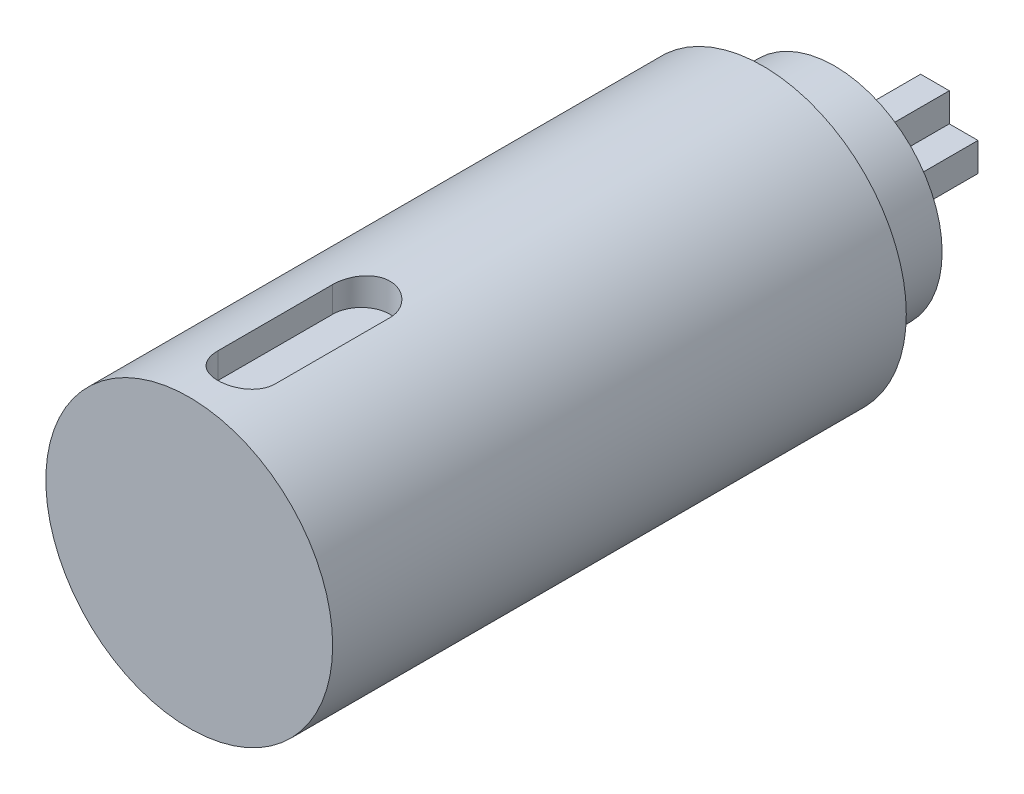
ISO-10303-21;
HEADER;
FILE_DESCRIPTION(('STEP AP214'),'2;1');
FILE_NAME('part.step','',(''),(''),'','','');
FILE_SCHEMA(('AUTOMOTIVE_DESIGN { 1 0 10303 214 1 1 1 1 }'));
ENDSEC;
DATA;
#1=APPLICATION_CONTEXT('core data for automotive mechanical design processes');
#2=APPLICATION_PROTOCOL_DEFINITION('international standard','automotive_design',2000,#1);
#3=PRODUCT_CONTEXT('',#1,'mechanical');
#4=PRODUCT('Part','Part','',(#3));
#5=PRODUCT_RELATED_PRODUCT_CATEGORY('part','',(#4));
#6=PRODUCT_DEFINITION_FORMATION('','',#4);
#7=PRODUCT_DEFINITION_CONTEXT('part definition',#1,'design');
#8=PRODUCT_DEFINITION('design','',#6,#7);
#9=PRODUCT_DEFINITION_SHAPE('','',#8);
#10=(LENGTH_UNIT() NAMED_UNIT(*) SI_UNIT(.MILLI.,.METRE.));
#11=(NAMED_UNIT(*) PLANE_ANGLE_UNIT() SI_UNIT($,.RADIAN.));
#12=(NAMED_UNIT(*) SI_UNIT($,.STERADIAN.) SOLID_ANGLE_UNIT());
#13=UNCERTAINTY_MEASURE_WITH_UNIT(LENGTH_MEASURE(1.E-05),#10,'distance_accuracy_value','');
#14=(GEOMETRIC_REPRESENTATION_CONTEXT(3) GLOBAL_UNCERTAINTY_ASSIGNED_CONTEXT((#13)) GLOBAL_UNIT_ASSIGNED_CONTEXT((#10,
#11,#12)) REPRESENTATION_CONTEXT('',''));
#15=CARTESIAN_POINT('',(0.,0.,0.));
#16=DIRECTION('',(0.,0.,1.));
#17=DIRECTION('',(1.,0.,0.));
#18=AXIS2_PLACEMENT_3D('',#15,#16,#17);
#19=CARTESIAN_POINT('',(0.,0.,0.));
#20=DIRECTION('',(0.,0.,1.));
#21=DIRECTION('',(1.,0.,0.));
#22=AXIS2_PLACEMENT_3D('',#19,#20,#21);
#23=PLANE('',#22);
#24=CARTESIAN_POINT('',(0.,0.,0.));
#25=DIRECTION('',(0.,0.,1.));
#26=DIRECTION('',(1.,0.,0.));
#27=AXIS2_PLACEMENT_3D('',#24,#25,#26);
#28=CIRCLE('',#27,7.5);
#29=CARTESIAN_POINT('',(7.5,0.,0.));
#30=VERTEX_POINT('',#29);
#31=EDGE_CURVE('E283',#30,#30,#28,.T.);
#32=ORIENTED_EDGE('',*,*,#31,.F.);
#33=EDGE_LOOP('',(#32));
#34=FACE_BOUND('',#33,.T.);
#35=DIRECTION('',(-1.,0.,0.));
#36=VECTOR('',#35,1.);
#37=CARTESIAN_POINT('',(0.,-1.,0.));
#38=LINE('',#37,#36);
#39=CARTESIAN_POINT('',(3.,-1.,0.));
#40=VERTEX_POINT('',#39);
#41=CARTESIAN_POINT('',(1.,-1.,0.));
#42=VERTEX_POINT('',#41);
#43=EDGE_CURVE('E62',#40,#42,#38,.T.);
#44=ORIENTED_EDGE('',*,*,#43,.F.);
#45=DIRECTION('',(0.,-1.,0.));
#46=VECTOR('',#45,1.);
#47=CARTESIAN_POINT('',(3.,0.,0.));
#48=LINE('',#47,#46);
#49=CARTESIAN_POINT('',(3.,1.,0.));
#50=VERTEX_POINT('',#49);
#51=EDGE_CURVE('E193',#50,#40,#48,.T.);
#52=ORIENTED_EDGE('',*,*,#51,.F.);
#53=DIRECTION('',(-1.,0.,0.));
#54=VECTOR('',#53,1.);
#55=CARTESIAN_POINT('',(0.,1.,0.));
#56=LINE('',#55,#54);
#57=CARTESIAN_POINT('',(1.,1.,0.));
#58=VERTEX_POINT('',#57);
#59=EDGE_CURVE('E245',#50,#58,#56,.T.);
#60=ORIENTED_EDGE('',*,*,#59,.T.);
#61=DIRECTION('',(0.,-1.,0.));
#62=VECTOR('',#61,1.);
#63=CARTESIAN_POINT('',(1.,0.,0.));
#64=LINE('',#63,#62);
#65=CARTESIAN_POINT('',(1.,3.,0.));
#66=VERTEX_POINT('',#65);
#67=EDGE_CURVE('E242',#66,#58,#64,.T.);
#68=ORIENTED_EDGE('',*,*,#67,.F.);
#69=DIRECTION('',(-1.,0.,0.));
#70=VECTOR('',#69,1.);
#71=CARTESIAN_POINT('',(0.,3.,0.));
#72=LINE('',#71,#70);
#73=CARTESIAN_POINT('',(-1.,3.,0.));
#74=VERTEX_POINT('',#73);
#75=EDGE_CURVE('E240',#66,#74,#72,.T.);
#76=ORIENTED_EDGE('',*,*,#75,.T.);
#77=DIRECTION('',(0.,-1.,0.));
#78=VECTOR('',#77,1.);
#79=CARTESIAN_POINT('',(-1.,0.,0.));
#80=LINE('',#79,#78);
#81=CARTESIAN_POINT('',(-1.,1.,0.));
#82=VERTEX_POINT('',#81);
#83=EDGE_CURVE('E238',#74,#82,#80,.T.);
#84=ORIENTED_EDGE('',*,*,#83,.T.);
#85=DIRECTION('',(-1.,0.,0.));
#86=VECTOR('',#85,1.);
#87=CARTESIAN_POINT('',(0.,1.,0.));
#88=LINE('',#87,#86);
#89=CARTESIAN_POINT('',(-3.,1.,0.));
#90=VERTEX_POINT('',#89);
#91=EDGE_CURVE('E236',#82,#90,#88,.T.);
#92=ORIENTED_EDGE('',*,*,#91,.T.);
#93=DIRECTION('',(0.,-1.,0.));
#94=VECTOR('',#93,1.);
#95=CARTESIAN_POINT('',(-3.,0.,0.));
#96=LINE('',#95,#94);
#97=CARTESIAN_POINT('',(-3.,-1.,0.));
#98=VERTEX_POINT('',#97);
#99=EDGE_CURVE('E234',#90,#98,#96,.T.);
#100=ORIENTED_EDGE('',*,*,#99,.T.);
#101=DIRECTION('',(-1.,0.,0.));
#102=VECTOR('',#101,1.);
#103=CARTESIAN_POINT('',(0.,-1.,0.));
#104=LINE('',#103,#102);
#105=CARTESIAN_POINT('',(-1.,-1.,0.));
#106=VERTEX_POINT('',#105);
#107=EDGE_CURVE('E231',#106,#98,#104,.T.);
#108=ORIENTED_EDGE('',*,*,#107,.F.);
#109=DIRECTION('',(0.,-1.,0.));
#110=VECTOR('',#109,1.);
#111=CARTESIAN_POINT('',(-1.,0.,0.));
#112=LINE('',#111,#110);
#113=CARTESIAN_POINT('',(-1.,-3.,0.));
#114=VERTEX_POINT('',#113);
#115=EDGE_CURVE('E229',#106,#114,#112,.T.);
#116=ORIENTED_EDGE('',*,*,#115,.T.);
#117=DIRECTION('',(-1.,0.,0.));
#118=VECTOR('',#117,1.);
#119=CARTESIAN_POINT('',(0.,-3.,0.));
#120=LINE('',#119,#118);
#121=CARTESIAN_POINT('',(1.,-3.,0.));
#122=VERTEX_POINT('',#121);
#123=EDGE_CURVE('E226',#122,#114,#120,.T.);
#124=ORIENTED_EDGE('',*,*,#123,.F.);
#125=DIRECTION('',(0.,-1.,0.));
#126=VECTOR('',#125,1.);
#127=CARTESIAN_POINT('',(1.,0.,0.));
#128=LINE('',#127,#126);
#129=EDGE_CURVE('E223',#42,#122,#128,.T.);
#130=ORIENTED_EDGE('',*,*,#129,.F.);
#131=EDGE_LOOP('',(#44,#52,#60,#68,#76,#84,#92,#100,#108,#116,#124,#130));
#132=FACE_BOUND('',#131,.T.);
#133=ADVANCED_FACE('F39',(#34,#132),#23,.F.);
#134=CARTESIAN_POINT('',(0.,0.,5.));
#135=DIRECTION('',(0.,0.,-1.));
#136=DIRECTION('',(-1.,0.,0.));
#137=AXIS2_PLACEMENT_3D('',#134,#135,#136);
#138=CYLINDRICAL_SURFACE('',#137,7.5);
#139=CARTESIAN_POINT('',(0.,0.,5.));
#140=DIRECTION('',(0.,0.,1.));
#141=DIRECTION('',(1.,0.,0.));
#142=AXIS2_PLACEMENT_3D('',#139,#140,#141);
#143=CIRCLE('',#142,7.5);
#144=CARTESIAN_POINT('',(7.5,0.,5.));
#145=VERTEX_POINT('',#144);
#146=EDGE_CURVE('E284',#145,#145,#143,.T.);
#147=ORIENTED_EDGE('',*,*,#146,.F.);
#148=EDGE_LOOP('',(#147));
#149=FACE_BOUND('',#148,.T.);
#150=ORIENTED_EDGE('',*,*,#31,.T.);
#151=EDGE_LOOP('',(#150));
#152=FACE_BOUND('',#151,.T.);
#153=ADVANCED_FACE('F41',(#149,#152),#138,.T.);
#154=CARTESIAN_POINT('',(0.,-1.,-7.));
#155=DIRECTION('',(0.,1.,0.));
#156=DIRECTION('',(-1.,0.,0.));
#157=AXIS2_PLACEMENT_3D('',#154,#155,#156);
#158=PLANE('',#157);
#159=ORIENTED_EDGE('',*,*,#43,.T.);
#160=DIRECTION('',(0.,0.,1.));
#161=VECTOR('',#160,1.);
#162=CARTESIAN_POINT('',(1.,-1.,-7.));
#163=LINE('',#162,#161);
#164=CARTESIAN_POINT('',(1.,-1.,-7.));
#165=VERTEX_POINT('',#164);
#166=EDGE_CURVE('E280',#165,#42,#163,.T.);
#167=ORIENTED_EDGE('',*,*,#166,.F.);
#168=DIRECTION('',(-1.,0.,0.));
#169=VECTOR('',#168,1.);
#170=CARTESIAN_POINT('',(0.,-1.,-7.));
#171=LINE('',#170,#169);
#172=CARTESIAN_POINT('',(3.,-1.,-7.));
#173=VERTEX_POINT('',#172);
#174=EDGE_CURVE('E189',#173,#165,#171,.T.);
#175=ORIENTED_EDGE('',*,*,#174,.F.);
#176=DIRECTION('',(0.,0.,1.));
#177=VECTOR('',#176,1.);
#178=CARTESIAN_POINT('',(3.,-1.,-7.));
#179=LINE('',#178,#177);
#180=EDGE_CURVE('E221',#173,#40,#179,.T.);
#181=ORIENTED_EDGE('',*,*,#180,.T.);
#182=EDGE_LOOP('',(#159,#167,#175,#181));
#183=FACE_BOUND('',#182,.T.);
#184=ADVANCED_FACE('F333',(#183),#158,.F.);
#185=CARTESIAN_POINT('',(1.,0.,-7.));
#186=DIRECTION('',(-1.,0.,0.));
#187=DIRECTION('',(0.,0.,1.));
#188=AXIS2_PLACEMENT_3D('',#185,#186,#187);
#189=PLANE('',#188);
#190=ORIENTED_EDGE('',*,*,#129,.T.);
#191=DIRECTION('',(0.,0.,1.));
#192=VECTOR('',#191,1.);
#193=CARTESIAN_POINT('',(1.,-3.,-7.));
#194=LINE('',#193,#192);
#195=CARTESIAN_POINT('',(1.,-3.,-7.));
#196=VERTEX_POINT('',#195);
#197=EDGE_CURVE('E277',#196,#122,#194,.T.);
#198=ORIENTED_EDGE('',*,*,#197,.F.);
#199=DIRECTION('',(0.,-1.,0.));
#200=VECTOR('',#199,1.);
#201=CARTESIAN_POINT('',(1.,0.,-7.));
#202=LINE('',#201,#200);
#203=EDGE_CURVE('E192',#165,#196,#202,.T.);
#204=ORIENTED_EDGE('',*,*,#203,.F.);
#205=ORIENTED_EDGE('',*,*,#166,.T.);
#206=EDGE_LOOP('',(#190,#198,#204,#205));
#207=FACE_BOUND('',#206,.T.);
#208=ADVANCED_FACE('F339',(#207),#189,.F.);
#209=CARTESIAN_POINT('',(0.,-3.,-7.));
#210=DIRECTION('',(0.,1.,0.));
#211=DIRECTION('',(-1.,0.,0.));
#212=AXIS2_PLACEMENT_3D('',#209,#210,#211);
#213=PLANE('',#212);
#214=ORIENTED_EDGE('',*,*,#123,.T.);
#215=DIRECTION('',(0.,0.,1.));
#216=VECTOR('',#215,1.);
#217=CARTESIAN_POINT('',(-1.,-3.,-7.));
#218=LINE('',#217,#216);
#219=CARTESIAN_POINT('',(-1.,-3.,-7.));
#220=VERTEX_POINT('',#219);
#221=EDGE_CURVE('E274',#220,#114,#218,.T.);
#222=ORIENTED_EDGE('',*,*,#221,.F.);
#223=DIRECTION('',(-1.,0.,0.));
#224=VECTOR('',#223,1.);
#225=CARTESIAN_POINT('',(0.,-3.,-7.));
#226=LINE('',#225,#224);
#227=EDGE_CURVE('E195',#196,#220,#226,.T.);
#228=ORIENTED_EDGE('',*,*,#227,.F.);
#229=ORIENTED_EDGE('',*,*,#197,.T.);
#230=EDGE_LOOP('',(#214,#222,#228,#229));
#231=FACE_BOUND('',#230,.T.);
#232=ADVANCED_FACE('F343',(#231),#213,.F.);
#233=CARTESIAN_POINT('',(-1.,0.,-7.));
#234=DIRECTION('',(-1.,0.,0.));
#235=DIRECTION('',(0.,0.,1.));
#236=AXIS2_PLACEMENT_3D('',#233,#234,#235);
#237=PLANE('',#236);
#238=ORIENTED_EDGE('',*,*,#115,.F.);
#239=DIRECTION('',(0.,0.,1.));
#240=VECTOR('',#239,1.);
#241=CARTESIAN_POINT('',(-1.,-1.,-7.));
#242=LINE('',#241,#240);
#243=CARTESIAN_POINT('',(-1.,-1.,-7.));
#244=VERTEX_POINT('',#243);
#245=EDGE_CURVE('E271',#244,#106,#242,.T.);
#246=ORIENTED_EDGE('',*,*,#245,.F.);
#247=DIRECTION('',(0.,-1.,0.));
#248=VECTOR('',#247,1.);
#249=CARTESIAN_POINT('',(-1.,0.,-7.));
#250=LINE('',#249,#248);
#251=EDGE_CURVE('E197',#244,#220,#250,.T.);
#252=ORIENTED_EDGE('',*,*,#251,.T.);
#253=ORIENTED_EDGE('',*,*,#221,.T.);
#254=EDGE_LOOP('',(#238,#246,#252,#253));
#255=FACE_BOUND('',#254,.T.);
#256=ADVANCED_FACE('F347',(#255),#237,.T.);
#257=CARTESIAN_POINT('',(0.,-1.,-7.));
#258=DIRECTION('',(0.,1.,0.));
#259=DIRECTION('',(-1.,0.,0.));
#260=AXIS2_PLACEMENT_3D('',#257,#258,#259);
#261=PLANE('',#260);
#262=ORIENTED_EDGE('',*,*,#107,.T.);
#263=DIRECTION('',(0.,0.,1.));
#264=VECTOR('',#263,1.);
#265=CARTESIAN_POINT('',(-3.,-1.,-7.));
#266=LINE('',#265,#264);
#267=CARTESIAN_POINT('',(-3.,-1.,-7.));
#268=VERTEX_POINT('',#267);
#269=EDGE_CURVE('E268',#268,#98,#266,.T.);
#270=ORIENTED_EDGE('',*,*,#269,.F.);
#271=DIRECTION('',(-1.,0.,0.));
#272=VECTOR('',#271,1.);
#273=CARTESIAN_POINT('',(0.,-1.,-7.));
#274=LINE('',#273,#272);
#275=EDGE_CURVE('E200',#244,#268,#274,.T.);
#276=ORIENTED_EDGE('',*,*,#275,.F.);
#277=ORIENTED_EDGE('',*,*,#245,.T.);
#278=EDGE_LOOP('',(#262,#270,#276,#277));
#279=FACE_BOUND('',#278,.T.);
#280=ADVANCED_FACE('F351',(#279),#261,.F.);
#281=CARTESIAN_POINT('',(-3.,0.,-7.));
#282=DIRECTION('',(-1.,0.,0.));
#283=DIRECTION('',(0.,0.,1.));
#284=AXIS2_PLACEMENT_3D('',#281,#282,#283);
#285=PLANE('',#284);
#286=ORIENTED_EDGE('',*,*,#99,.F.);
#287=DIRECTION('',(0.,0.,1.));
#288=VECTOR('',#287,1.);
#289=CARTESIAN_POINT('',(-3.,1.,-7.));
#290=LINE('',#289,#288);
#291=CARTESIAN_POINT('',(-3.,1.,-7.));
#292=VERTEX_POINT('',#291);
#293=EDGE_CURVE('E265',#292,#90,#290,.T.);
#294=ORIENTED_EDGE('',*,*,#293,.F.);
#295=DIRECTION('',(0.,-1.,0.));
#296=VECTOR('',#295,1.);
#297=CARTESIAN_POINT('',(-3.,0.,-7.));
#298=LINE('',#297,#296);
#299=EDGE_CURVE('E202',#292,#268,#298,.T.);
#300=ORIENTED_EDGE('',*,*,#299,.T.);
#301=ORIENTED_EDGE('',*,*,#269,.T.);
#302=EDGE_LOOP('',(#286,#294,#300,#301));
#303=FACE_BOUND('',#302,.T.);
#304=ADVANCED_FACE('F355',(#303),#285,.T.);
#305=CARTESIAN_POINT('',(0.,1.,-7.));
#306=DIRECTION('',(0.,1.,0.));
#307=DIRECTION('',(0.,0.,1.));
#308=AXIS2_PLACEMENT_3D('',#305,#306,#307);
#309=PLANE('',#308);
#310=ORIENTED_EDGE('',*,*,#91,.F.);
#311=DIRECTION('',(0.,0.,1.));
#312=VECTOR('',#311,1.);
#313=CARTESIAN_POINT('',(-1.,1.,-7.));
#314=LINE('',#313,#312);
#315=CARTESIAN_POINT('',(-1.,1.,-7.));
#316=VERTEX_POINT('',#315);
#317=EDGE_CURVE('E262',#316,#82,#314,.T.);
#318=ORIENTED_EDGE('',*,*,#317,.F.);
#319=DIRECTION('',(-1.,0.,0.));
#320=VECTOR('',#319,1.);
#321=CARTESIAN_POINT('',(0.,1.,-7.));
#322=LINE('',#321,#320);
#323=EDGE_CURVE('E205',#316,#292,#322,.T.);
#324=ORIENTED_EDGE('',*,*,#323,.T.);
#325=ORIENTED_EDGE('',*,*,#293,.T.);
#326=EDGE_LOOP('',(#310,#318,#324,#325));
#327=FACE_BOUND('',#326,.T.);
#328=ADVANCED_FACE('F359',(#327),#309,.T.);
#329=CARTESIAN_POINT('',(-1.,0.,-7.));
#330=DIRECTION('',(-1.,0.,0.));
#331=DIRECTION('',(0.,0.,1.));
#332=AXIS2_PLACEMENT_3D('',#329,#330,#331);
#333=PLANE('',#332);
#334=ORIENTED_EDGE('',*,*,#83,.F.);
#335=DIRECTION('',(0.,0.,1.));
#336=VECTOR('',#335,1.);
#337=CARTESIAN_POINT('',(-1.,3.,-7.));
#338=LINE('',#337,#336);
#339=CARTESIAN_POINT('',(-1.,3.,-7.));
#340=VERTEX_POINT('',#339);
#341=EDGE_CURVE('E259',#340,#74,#338,.T.);
#342=ORIENTED_EDGE('',*,*,#341,.F.);
#343=DIRECTION('',(0.,-1.,0.));
#344=VECTOR('',#343,1.);
#345=CARTESIAN_POINT('',(-1.,0.,-7.));
#346=LINE('',#345,#344);
#347=EDGE_CURVE('E208',#340,#316,#346,.T.);
#348=ORIENTED_EDGE('',*,*,#347,.T.);
#349=ORIENTED_EDGE('',*,*,#317,.T.);
#350=EDGE_LOOP('',(#334,#342,#348,#349));
#351=FACE_BOUND('',#350,.T.);
#352=ADVANCED_FACE('F363',(#351),#333,.T.);
#353=CARTESIAN_POINT('',(0.,3.,-7.));
#354=DIRECTION('',(0.,1.,0.));
#355=DIRECTION('',(-1.,0.,0.));
#356=AXIS2_PLACEMENT_3D('',#353,#354,#355);
#357=PLANE('',#356);
#358=ORIENTED_EDGE('',*,*,#75,.F.);
#359=DIRECTION('',(0.,0.,1.));
#360=VECTOR('',#359,1.);
#361=CARTESIAN_POINT('',(1.,3.,-7.));
#362=LINE('',#361,#360);
#363=CARTESIAN_POINT('',(1.,3.,-7.));
#364=VERTEX_POINT('',#363);
#365=EDGE_CURVE('E256',#364,#66,#362,.T.);
#366=ORIENTED_EDGE('',*,*,#365,.F.);
#367=DIRECTION('',(-1.,0.,0.));
#368=VECTOR('',#367,1.);
#369=CARTESIAN_POINT('',(0.,3.,-7.));
#370=LINE('',#369,#368);
#371=EDGE_CURVE('E211',#364,#340,#370,.T.);
#372=ORIENTED_EDGE('',*,*,#371,.T.);
#373=ORIENTED_EDGE('',*,*,#341,.T.);
#374=EDGE_LOOP('',(#358,#366,#372,#373));
#375=FACE_BOUND('',#374,.T.);
#376=ADVANCED_FACE('F367',(#375),#357,.T.);
#377=CARTESIAN_POINT('',(1.,0.,-7.));
#378=DIRECTION('',(-1.,0.,0.));
#379=DIRECTION('',(0.,0.,1.));
#380=AXIS2_PLACEMENT_3D('',#377,#378,#379);
#381=PLANE('',#380);
#382=ORIENTED_EDGE('',*,*,#67,.T.);
#383=DIRECTION('',(0.,0.,1.));
#384=VECTOR('',#383,1.);
#385=CARTESIAN_POINT('',(1.,1.,-7.));
#386=LINE('',#385,#384);
#387=CARTESIAN_POINT('',(1.,1.,-7.));
#388=VERTEX_POINT('',#387);
#389=EDGE_CURVE('E253',#388,#58,#386,.T.);
#390=ORIENTED_EDGE('',*,*,#389,.F.);
#391=DIRECTION('',(0.,-1.,0.));
#392=VECTOR('',#391,1.);
#393=CARTESIAN_POINT('',(1.,0.,-7.));
#394=LINE('',#393,#392);
#395=EDGE_CURVE('E214',#364,#388,#394,.T.);
#396=ORIENTED_EDGE('',*,*,#395,.F.);
#397=ORIENTED_EDGE('',*,*,#365,.T.);
#398=EDGE_LOOP('',(#382,#390,#396,#397));
#399=FACE_BOUND('',#398,.T.);
#400=ADVANCED_FACE('F371',(#399),#381,.F.);
#401=CARTESIAN_POINT('',(0.,1.,-7.));
#402=DIRECTION('',(0.,1.,0.));
#403=DIRECTION('',(0.,0.,1.));
#404=AXIS2_PLACEMENT_3D('',#401,#402,#403);
#405=PLANE('',#404);
#406=ORIENTED_EDGE('',*,*,#59,.F.);
#407=DIRECTION('',(0.,0.,1.));
#408=VECTOR('',#407,1.);
#409=CARTESIAN_POINT('',(3.,1.,-7.));
#410=LINE('',#409,#408);
#411=CARTESIAN_POINT('',(3.,1.,-7.));
#412=VERTEX_POINT('',#411);
#413=EDGE_CURVE('E250',#412,#50,#410,.T.);
#414=ORIENTED_EDGE('',*,*,#413,.F.);
#415=DIRECTION('',(-1.,0.,0.));
#416=VECTOR('',#415,1.);
#417=CARTESIAN_POINT('',(0.,1.,-7.));
#418=LINE('',#417,#416);
#419=EDGE_CURVE('E216',#412,#388,#418,.T.);
#420=ORIENTED_EDGE('',*,*,#419,.T.);
#421=ORIENTED_EDGE('',*,*,#389,.T.);
#422=EDGE_LOOP('',(#406,#414,#420,#421));
#423=FACE_BOUND('',#422,.T.);
#424=ADVANCED_FACE('F375',(#423),#405,.T.);
#425=CARTESIAN_POINT('',(3.,0.,-7.));
#426=DIRECTION('',(-1.,0.,0.));
#427=DIRECTION('',(0.,0.,1.));
#428=AXIS2_PLACEMENT_3D('',#425,#426,#427);
#429=PLANE('',#428);
#430=ORIENTED_EDGE('',*,*,#51,.T.);
#431=ORIENTED_EDGE('',*,*,#180,.F.);
#432=DIRECTION('',(0.,-1.,0.));
#433=VECTOR('',#432,1.);
#434=CARTESIAN_POINT('',(3.,0.,-7.));
#435=LINE('',#434,#433);
#436=EDGE_CURVE('E219',#412,#173,#435,.T.);
#437=ORIENTED_EDGE('',*,*,#436,.F.);
#438=ORIENTED_EDGE('',*,*,#413,.T.);
#439=EDGE_LOOP('',(#430,#431,#437,#438));
#440=FACE_BOUND('',#439,.T.);
#441=ADVANCED_FACE('F379',(#440),#429,.F.);
#442=CARTESIAN_POINT('',(0.,0.,-7.));
#443=DIRECTION('',(0.,0.,-1.));
#444=DIRECTION('',(-1.,0.,0.));
#445=AXIS2_PLACEMENT_3D('',#442,#443,#444);
#446=PLANE('',#445);
#447=ORIENTED_EDGE('',*,*,#174,.T.);
#448=ORIENTED_EDGE('',*,*,#203,.T.);
#449=ORIENTED_EDGE('',*,*,#227,.T.);
#450=ORIENTED_EDGE('',*,*,#251,.F.);
#451=ORIENTED_EDGE('',*,*,#275,.T.);
#452=ORIENTED_EDGE('',*,*,#299,.F.);
#453=ORIENTED_EDGE('',*,*,#323,.F.);
#454=ORIENTED_EDGE('',*,*,#347,.F.);
#455=ORIENTED_EDGE('',*,*,#371,.F.);
#456=ORIENTED_EDGE('',*,*,#395,.T.);
#457=ORIENTED_EDGE('',*,*,#419,.F.);
#458=ORIENTED_EDGE('',*,*,#436,.T.);
#459=EDGE_LOOP('',(#447,#448,#449,#450,#451,#452,#453,#454,#455,#456,#457,#458));
#460=FACE_BOUND('',#459,.T.);
#461=ADVANCED_FACE('F382',(#460),#446,.T.);
#462=CARTESIAN_POINT('',(0.,0.,45.));
#463=DIRECTION('',(0.,0.,-1.));
#464=DIRECTION('',(-1.,0.,0.));
#465=AXIS2_PLACEMENT_3D('',#462,#463,#464);
#466=CYLINDRICAL_SURFACE('',#465,10.);
#467=DIRECTION('',(0.,0.,-1.));
#468=VECTOR('',#467,1.);
#469=CARTESIAN_POINT('',(-2.,9.79795897113271,45.));
#470=LINE('',#469,#468);
#471=CARTESIAN_POINT('',(-2.,9.79795897113271,41.));
#472=VERTEX_POINT('',#471);
#473=CARTESIAN_POINT('',(-2.,9.79795897113271,33.));
#474=VERTEX_POINT('',#473);
#475=EDGE_CURVE('E11',#472,#474,#470,.T.);
#476=ORIENTED_EDGE('',*,*,#475,.T.);
#477=CARTESIAN_POINT('',(-2.,9.79795897113271,33.));
#478=CARTESIAN_POINT('',(-2.00000029709046,9.79795611157838,32.9443328627013));
#479=CARTESIAN_POINT('',(-1.99767440405642,9.79843398465431,32.8886929611951));
#480=CARTESIAN_POINT('',(-1.98839986829158,9.80032138150132,32.7778225643325));
#481=CARTESIAN_POINT('',(-1.98145179742019,9.80173079002197,32.7225920191848));
#482=CARTESIAN_POINT('',(-1.95376239954903,9.8073028328515,32.5582901196984));
#483=CARTESIAN_POINT('',(-1.92617555297558,9.81280956758554,32.4503371424655));
#484=CARTESIAN_POINT('',(-1.85359362042638,9.8267766040168,32.2407148065161));
#485=CARTESIAN_POINT('',(-1.80859661275257,9.83523723174864,32.1390461428865));
#486=CARTESIAN_POINT('',(-1.7025082088197,9.85415440257657,31.9446702322403));
#487=CARTESIAN_POINT('',(-1.64141514447461,9.86461115250626,31.8519639153823));
#488=CARTESIAN_POINT('',(-1.50396101869286,9.88650550448304,31.6768803266299));
#489=CARTESIAN_POINT('',(-1.42741780364327,9.89795377776164,31.5946474355412));
#490=CARTESIAN_POINT('',(-1.26162118198369,9.92044851228358,31.4440911214249));
#491=CARTESIAN_POINT('',(-1.17236580968335,9.93149491105252,31.375769853539));
#492=CARTESIAN_POINT('',(-0.982720106800587,9.95205620855081,31.2544221981525));
#493=CARTESIAN_POINT('',(-0.882239649549982,9.96155694564014,31.2015340615754));
#494=CARTESIAN_POINT('',(-0.673602404217795,9.97783510908995,31.1134482309004));
#495=CARTESIAN_POINT('',(-0.565446754297824,9.9846129382442,31.0782479200882));
#496=CARTESIAN_POINT('',(-0.3460348177742,9.99460635553984,31.0269859030621));
#497=CARTESIAN_POINT('',(-0.234838069151992,9.99786765043076,31.0106784210322));
#498=CARTESIAN_POINT('',(-0.0112397534982613,10.0006184349224,30.9968980411232));
#499=CARTESIAN_POINT('',(0.101161724783848,10.000108200481,30.9994237652431));
#500=CARTESIAN_POINT('',(0.322284405513385,9.99540868887644,31.0230524007432));
#501=CARTESIAN_POINT('',(0.43103522671446,9.9912719366342,31.0438900998095));
#502=CARTESIAN_POINT('',(0.643464013108169,9.97984349003516,31.1031303539521));
#503=CARTESIAN_POINT('',(0.747141812282547,9.97255169250401,31.1415334834445));
#504=CARTESIAN_POINT('',(0.947240542625921,9.95554578241051,31.2350608069907));
#505=CARTESIAN_POINT('',(1.04361145363295,9.94581664782192,31.2902891738519));
#506=CARTESIAN_POINT('',(1.22581287576612,9.92500903258345,31.4158205405534));
#507=CARTESIAN_POINT('',(1.31164251244036,9.91393044014086,31.4861247896875));
#508=CARTESIAN_POINT('',(1.47189241307715,9.8914207473701,31.6412567232504));
#509=CARTESIAN_POINT('',(1.54608938999208,9.8799868648348,31.7263148041431));
#510=CARTESIAN_POINT('',(1.6792217997989,9.85823412232848,31.9078095169778));
#511=CARTESIAN_POINT('',(1.73815300484306,9.84791557170815,32.0042492903325));
#512=CARTESIAN_POINT('',(1.83915990928954,9.82955460084642,32.2061048098918));
#513=CARTESIAN_POINT('',(1.881189753269,9.8215183899669,32.3115440467931));
#514=CARTESIAN_POINT('',(1.94681419465982,9.80872322124987,32.5281172625114));
#515=CARTESIAN_POINT('',(1.97043625496866,9.80395938256574,32.6392424932963));
#516=CARTESIAN_POINT('',(1.98966587624393,9.80006354383926,32.7927136336929));
#517=CARTESIAN_POINT('',(1.99354251131102,9.79927519743986,32.8341082795649));
#518=CARTESIAN_POINT('',(1.9987063293293,9.79822334773544,32.9169957282748));
#519=CARTESIAN_POINT('',(1.99999784580931,9.79795896609649,32.9584882499116));
#520=CARTESIAN_POINT('',(2.,9.79795897113271,33.));
#521=B_SPLINE_CURVE_WITH_KNOTS('',3,(#477,#478,#479,#480,#481,#482,#483,#484,#485,#486,#487,
#488,#489,#490,#491,#492,#493,#494,#495,#496,#497,#498,#499,#500,#501,#502,#503,#504,#505,#506,
#507,#508,#509,#510,#511,#512,#513,#514,#515,#516,#517,#518,#519,#520),.UNSPECIFIED.,.F.,.F.,(4,
2,2,2,2,2,2,2,2,2,2,2,2,2,2,2,2,2,2,2,2,4),(0.,0.166897020715838,0.33377339664307,
0.666722601037227,0.999708566174139,1.33272905329863,1.66993288931439,2.00718892413592,
2.34737937755194,2.68751948879678,3.02318320738907,3.35882236614862,3.68967912555437,
4.0205467052512,4.35350597112352,4.68649283901807,5.02524540329292,5.36409168485659,
5.70385119298727,6.04310283225105,6.16778801087552,6.29226399953897),.UNSPECIFIED.);
#522=CARTESIAN_POINT('',(2.,9.79795897113271,33.));
#523=VERTEX_POINT('',#522);
#524=EDGE_CURVE('E287',#474,#523,#521,.T.);
#525=ORIENTED_EDGE('',*,*,#524,.T.);
#526=DIRECTION('',(0.,0.,-1.));
#527=VECTOR('',#526,1.);
#528=CARTESIAN_POINT('',(2.,9.79795897113271,45.));
#529=LINE('',#528,#527);
#530=CARTESIAN_POINT('',(2.,9.79795897113271,41.));
#531=VERTEX_POINT('',#530);
#532=EDGE_CURVE('E47',#523,#531,#529,.F.);
#533=ORIENTED_EDGE('',*,*,#532,.T.);
#534=CARTESIAN_POINT('',(2.,9.79795897113271,41.));
#535=CARTESIAN_POINT('',(2.00000029709046,9.79795611157838,41.0556671372987));
#536=CARTESIAN_POINT('',(1.99767440405642,9.79843398465431,41.1113070388049));
#537=CARTESIAN_POINT('',(1.98839986829158,9.80032138150132,41.2221774356675));
#538=CARTESIAN_POINT('',(1.98145179742019,9.80173079002197,41.2774079808152));
#539=CARTESIAN_POINT('',(1.95376239954903,9.8073028328515,41.4417098803016));
#540=CARTESIAN_POINT('',(1.92617555297558,9.81280956758554,41.5496628575345));
#541=CARTESIAN_POINT('',(1.85359362042638,9.8267766040168,41.7592851934839));
#542=CARTESIAN_POINT('',(1.80859661275257,9.83523723174864,41.8609538571135));
#543=CARTESIAN_POINT('',(1.7025082088197,9.85415440257657,42.0553297677597));
#544=CARTESIAN_POINT('',(1.64141514447461,9.86461115250626,42.1480360846177));
#545=CARTESIAN_POINT('',(1.50396101869286,9.88650550448304,42.3231196733701));
#546=CARTESIAN_POINT('',(1.42741780364327,9.89795377776164,42.4053525644588));
#547=CARTESIAN_POINT('',(1.26162118198369,9.92044851228358,42.5559088785751));
#548=CARTESIAN_POINT('',(1.17236580968335,9.93149491105252,42.624230146461));
#549=CARTESIAN_POINT('',(0.982720106800586,9.95205620855081,42.7455778018475));
#550=CARTESIAN_POINT('',(0.88223964954998,9.96155694564014,42.7984659384246));
#551=CARTESIAN_POINT('',(0.673602404217793,9.97783510908995,42.8865517690995));
#552=CARTESIAN_POINT('',(0.565446754297825,9.9846129382442,42.9217520799118));
#553=CARTESIAN_POINT('',(0.346034817774201,9.99460635553984,42.9730140969379));
#554=CARTESIAN_POINT('',(0.234838069151993,9.99786765043076,42.9893215789678));
#555=CARTESIAN_POINT('',(0.0112397534982613,10.0006184349224,43.0031019588768));
#556=CARTESIAN_POINT('',(-0.101161724783847,10.000108200481,43.0005762347569));
#557=CARTESIAN_POINT('',(-0.322284405513385,9.99540868887644,42.9769475992568));
#558=CARTESIAN_POINT('',(-0.431035226714461,9.9912719366342,42.9561099001905));
#559=CARTESIAN_POINT('',(-0.643464013108169,9.97984349003516,42.8968696460479));
#560=CARTESIAN_POINT('',(-0.747141812282547,9.97255169250401,42.8584665165555));
#561=CARTESIAN_POINT('',(-0.947240542625919,9.95554578241051,42.7649391930093));
#562=CARTESIAN_POINT('',(-1.04361145363294,9.94581664782193,42.7097108261481));
#563=CARTESIAN_POINT('',(-1.22581287576612,9.92500903258345,42.5841794594466));
#564=CARTESIAN_POINT('',(-1.31164251244036,9.91393044014086,42.5138752103125));
#565=CARTESIAN_POINT('',(-1.47189241307715,9.8914207473701,42.3587432767495));
#566=CARTESIAN_POINT('',(-1.54608938999208,9.8799868648348,42.2736851958569));
#567=CARTESIAN_POINT('',(-1.67922179979889,9.85823412232848,42.0921904830222));
#568=CARTESIAN_POINT('',(-1.73815300484306,9.84791557170815,41.9957507096675));
#569=CARTESIAN_POINT('',(-1.83915990928954,9.82955460084642,41.7938951901082));
#570=CARTESIAN_POINT('',(-1.881189753269,9.8215183899669,41.6884559532068));
#571=CARTESIAN_POINT('',(-1.94681419465982,9.80872322124987,41.4718827374886));
#572=CARTESIAN_POINT('',(-1.97043625496866,9.80395938256574,41.3607575067037));
#573=CARTESIAN_POINT('',(-1.98966587624393,9.80006354383926,41.2072863663071));
#574=CARTESIAN_POINT('',(-1.99354251131102,9.79927519743986,41.1658917204351));
#575=CARTESIAN_POINT('',(-1.9987063293293,9.79822334773544,41.0830042717251));
#576=CARTESIAN_POINT('',(-1.99999784580931,9.79795896609649,41.0415117500884));
#577=CARTESIAN_POINT('',(-2.,9.79795897113271,41.));
#578=B_SPLINE_CURVE_WITH_KNOTS('',3,(#534,#535,#536,#537,#538,#539,#540,#541,#542,#543,#544,
#545,#546,#547,#548,#549,#550,#551,#552,#553,#554,#555,#556,#557,#558,#559,#560,#561,#562,#563,
#564,#565,#566,#567,#568,#569,#570,#571,#572,#573,#574,#575,#576,#577),.UNSPECIFIED.,.F.,.F.,(4,
2,2,2,2,2,2,2,2,2,2,2,2,2,2,2,2,2,2,2,2,4),(0.,0.166897020715838,0.333773396643063,
0.666722601037227,0.999708566174147,1.33272905329863,1.66993288931439,2.00718892413592,
2.34737937755194,2.68751948879678,3.02318320738907,3.35882236614862,3.68967912555437,
4.0205467052512,4.35350597112352,4.68649283901807,5.02524540329292,5.36409168485659,
5.70385119298727,6.04310283225105,6.16778801087552,6.29226399953898),.UNSPECIFIED.);
#579=EDGE_CURVE('E54',#531,#472,#578,.T.);
#580=ORIENTED_EDGE('',*,*,#579,.T.);
#581=EDGE_LOOP('',(#476,#525,#533,#580));
#582=FACE_BOUND('',#581,.T.);
#583=CARTESIAN_POINT('',(0.,0.,45.));
#584=DIRECTION('',(0.,0.,1.));
#585=DIRECTION('',(1.,0.,0.));
#586=AXIS2_PLACEMENT_3D('',#583,#584,#585);
#587=CIRCLE('',#586,10.);
#588=CARTESIAN_POINT('',(10.,0.,45.));
#589=VERTEX_POINT('',#588);
#590=EDGE_CURVE('E184',#589,#589,#587,.T.);
#591=ORIENTED_EDGE('',*,*,#590,.F.);
#592=EDGE_LOOP('',(#591));
#593=FACE_BOUND('',#592,.T.);
#594=CARTESIAN_POINT('',(0.,0.,5.));
#595=DIRECTION('',(0.,0.,1.));
#596=DIRECTION('',(1.,0.,0.));
#597=AXIS2_PLACEMENT_3D('',#594,#595,#596);
#598=CIRCLE('',#597,10.);
#599=CARTESIAN_POINT('',(10.,0.,5.));
#600=VERTEX_POINT('',#599);
#601=EDGE_CURVE('E179',#600,#600,#598,.T.);
#602=ORIENTED_EDGE('',*,*,#601,.T.);
#603=EDGE_LOOP('',(#602));
#604=FACE_BOUND('',#603,.T.);
#605=ADVANCED_FACE('F303',(#582,#593,#604),#466,.T.);
#606=CARTESIAN_POINT('',(0.,0.,45.));
#607=DIRECTION('',(0.,0.,1.));
#608=DIRECTION('',(1.,0.,0.));
#609=AXIS2_PLACEMENT_3D('',#606,#607,#608);
#610=PLANE('',#609);
#611=ORIENTED_EDGE('',*,*,#590,.T.);
#612=EDGE_LOOP('',(#611));
#613=FACE_BOUND('',#612,.T.);
#614=ADVANCED_FACE('F320',(#613),#610,.T.);
#615=CARTESIAN_POINT('',(0.,0.,5.));
#616=DIRECTION('',(0.,0.,1.));
#617=DIRECTION('',(1.,0.,0.));
#618=AXIS2_PLACEMENT_3D('',#615,#616,#617);
#619=PLANE('',#618);
#620=ORIENTED_EDGE('',*,*,#146,.T.);
#621=EDGE_LOOP('',(#620));
#622=FACE_BOUND('',#621,.T.);
#623=ORIENTED_EDGE('',*,*,#601,.F.);
#624=EDGE_LOOP('',(#623));
#625=FACE_BOUND('',#624,.T.);
#626=ADVANCED_FACE('F319',(#622,#625),#619,.F.);
#627=CARTESIAN_POINT('',(0.,8.,41.));
#628=DIRECTION('',(0.,1.,0.));
#629=DIRECTION('',(0.,0.,1.));
#630=AXIS2_PLACEMENT_3D('',#627,#628,#629);
#631=CYLINDRICAL_SURFACE('',#630,2.);
#632=DIRECTION('',(0.,1.,0.));
#633=VECTOR('',#632,1.);
#634=CARTESIAN_POINT('',(2.,8.,41.));
#635=LINE('',#634,#633);
#636=CARTESIAN_POINT('',(2.,8.,41.));
#637=VERTEX_POINT('',#636);
#638=EDGE_CURVE('E151',#637,#531,#635,.T.);
#639=ORIENTED_EDGE('',*,*,#638,.F.);
#640=CARTESIAN_POINT('',(0.,8.,41.));
#641=DIRECTION('',(0.,1.,0.));
#642=DIRECTION('',(0.,0.,1.));
#643=AXIS2_PLACEMENT_3D('',#640,#641,#642);
#644=CIRCLE('',#643,2.);
#645=CARTESIAN_POINT('',(-2.,8.,41.));
#646=VERTEX_POINT('',#645);
#647=EDGE_CURVE('E155',#646,#637,#644,.T.);
#648=ORIENTED_EDGE('',*,*,#647,.F.);
#649=DIRECTION('',(0.,1.,0.));
#650=VECTOR('',#649,1.);
#651=CARTESIAN_POINT('',(-2.,8.,41.));
#652=LINE('',#651,#650);
#653=EDGE_CURVE('E177',#646,#472,#652,.T.);
#654=ORIENTED_EDGE('',*,*,#653,.T.);
#655=ORIENTED_EDGE('',*,*,#579,.F.);
#656=EDGE_LOOP('',(#639,#648,#654,#655));
#657=FACE_BOUND('',#656,.T.);
#658=ADVANCED_FACE('F153',(#657),#631,.F.);
#659=CARTESIAN_POINT('',(-2.,8.,41.));
#660=DIRECTION('',(-1.,0.,0.));
#661=DIRECTION('',(0.,0.,1.));
#662=AXIS2_PLACEMENT_3D('',#659,#660,#661);
#663=PLANE('',#662);
#664=ORIENTED_EDGE('',*,*,#653,.F.);
#665=DIRECTION('',(0.,0.,1.));
#666=VECTOR('',#665,1.);
#667=CARTESIAN_POINT('',(-2.,8.,41.));
#668=LINE('',#667,#666);
#669=CARTESIAN_POINT('',(-2.,8.,33.));
#670=VERTEX_POINT('',#669);
#671=EDGE_CURVE('E160',#670,#646,#668,.T.);
#672=ORIENTED_EDGE('',*,*,#671,.F.);
#673=DIRECTION('',(0.,1.,0.));
#674=VECTOR('',#673,1.);
#675=CARTESIAN_POINT('',(-2.,8.,33.));
#676=LINE('',#675,#674);
#677=EDGE_CURVE('E180',#670,#474,#676,.T.);
#678=ORIENTED_EDGE('',*,*,#677,.T.);
#679=ORIENTED_EDGE('',*,*,#475,.F.);
#680=EDGE_LOOP('',(#664,#672,#678,#679));
#681=FACE_BOUND('',#680,.T.);
#682=ADVANCED_FACE('F312',(#681),#663,.F.);
#683=CARTESIAN_POINT('',(0.,8.,33.));
#684=DIRECTION('',(0.,1.,0.));
#685=DIRECTION('',(0.,0.,1.));
#686=AXIS2_PLACEMENT_3D('',#683,#684,#685);
#687=CYLINDRICAL_SURFACE('',#686,2.);
#688=ORIENTED_EDGE('',*,*,#677,.F.);
#689=CARTESIAN_POINT('',(0.,8.,33.));
#690=DIRECTION('',(0.,1.,0.));
#691=DIRECTION('',(0.,0.,1.));
#692=AXIS2_PLACEMENT_3D('',#689,#690,#691);
#693=CIRCLE('',#692,2.);
#694=CARTESIAN_POINT('',(2.,8.,33.));
#695=VERTEX_POINT('',#694);
#696=EDGE_CURVE('E169',#695,#670,#693,.T.);
#697=ORIENTED_EDGE('',*,*,#696,.F.);
#698=DIRECTION('',(0.,1.,0.));
#699=VECTOR('',#698,1.);
#700=CARTESIAN_POINT('',(2.,8.,33.));
#701=LINE('',#700,#699);
#702=EDGE_CURVE('E159',#695,#523,#701,.T.);
#703=ORIENTED_EDGE('',*,*,#702,.T.);
#704=ORIENTED_EDGE('',*,*,#524,.F.);
#705=EDGE_LOOP('',(#688,#697,#703,#704));
#706=FACE_BOUND('',#705,.T.);
#707=ADVANCED_FACE('F307',(#706),#687,.F.);
#708=CARTESIAN_POINT('',(2.,8.,41.));
#709=DIRECTION('',(1.,0.,0.));
#710=DIRECTION('',(0.,0.,-1.));
#711=AXIS2_PLACEMENT_3D('',#708,#709,#710);
#712=PLANE('',#711);
#713=ORIENTED_EDGE('',*,*,#702,.F.);
#714=DIRECTION('',(0.,0.,-1.));
#715=VECTOR('',#714,1.);
#716=CARTESIAN_POINT('',(2.,8.,41.));
#717=LINE('',#716,#715);
#718=EDGE_CURVE('E163',#637,#695,#717,.T.);
#719=ORIENTED_EDGE('',*,*,#718,.F.);
#720=ORIENTED_EDGE('',*,*,#638,.T.);
#721=ORIENTED_EDGE('',*,*,#532,.F.);
#722=EDGE_LOOP('',(#713,#719,#720,#721));
#723=FACE_BOUND('',#722,.T.);
#724=ADVANCED_FACE('F164',(#723),#712,.F.);
#725=CARTESIAN_POINT('',(0.,8.,41.));
#726=DIRECTION('',(0.,1.,0.));
#727=DIRECTION('',(0.,0.,1.));
#728=AXIS2_PLACEMENT_3D('',#725,#726,#727);
#729=PLANE('',#728);
#730=ORIENTED_EDGE('',*,*,#647,.T.);
#731=ORIENTED_EDGE('',*,*,#718,.T.);
#732=ORIENTED_EDGE('',*,*,#696,.T.);
#733=ORIENTED_EDGE('',*,*,#671,.T.);
#734=EDGE_LOOP('',(#730,#731,#732,#733));
#735=FACE_BOUND('',#734,.T.);
#736=ADVANCED_FACE('F171',(#735),#729,.T.);
#737=CLOSED_SHELL('',(#133,#153,#184,#208,#232,#256,#280,#304,#328,#352,#376,#400,#424,#441,
#461,#605,#614,#626,#658,#682,#707,#724,#736));
#738=MANIFOLD_SOLID_BREP('B2',#737);
#739=ADVANCED_BREP_SHAPE_REPRESENTATION('',(#18,#738),#14);
#740=SHAPE_DEFINITION_REPRESENTATION(#9,#739);
ENDSEC;
END-ISO-10303-21;
